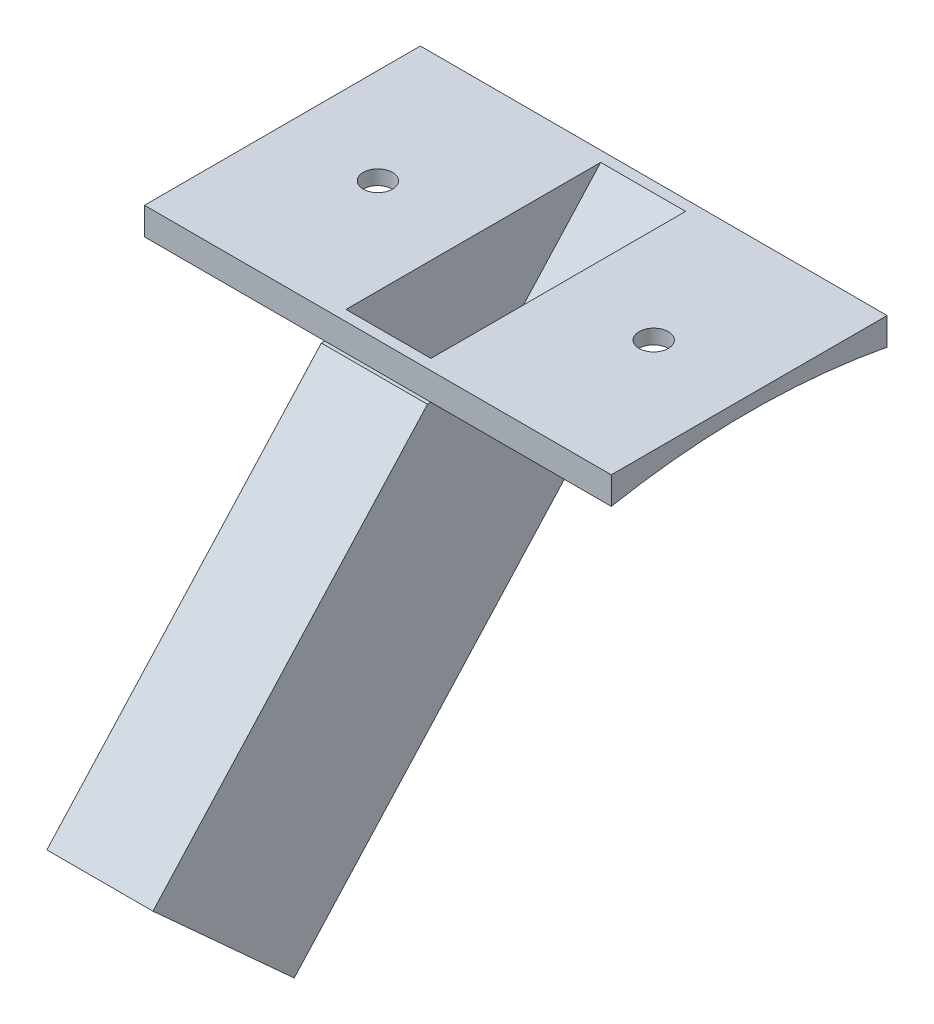
ISO-10303-21;
HEADER;
FILE_DESCRIPTION(('STEP AP214'),'2;1');
FILE_NAME('part.step','',(''),(''),'','','');
FILE_SCHEMA(('AUTOMOTIVE_DESIGN { 1 0 10303 214 1 1 1 1 }'));
ENDSEC;
DATA;
#1=APPLICATION_CONTEXT('core data for automotive mechanical design processes');
#2=APPLICATION_PROTOCOL_DEFINITION('international standard','automotive_design',2000,#1);
#3=PRODUCT_CONTEXT('',#1,'mechanical');
#4=PRODUCT('Part','Part','',(#3));
#5=PRODUCT_RELATED_PRODUCT_CATEGORY('part','',(#4));
#6=PRODUCT_DEFINITION_FORMATION('','',#4);
#7=PRODUCT_DEFINITION_CONTEXT('part definition',#1,'design');
#8=PRODUCT_DEFINITION('design','',#6,#7);
#9=PRODUCT_DEFINITION_SHAPE('','',#8);
#10=(LENGTH_UNIT() NAMED_UNIT(*) SI_UNIT(.MILLI.,.METRE.));
#11=(NAMED_UNIT(*) PLANE_ANGLE_UNIT() SI_UNIT($,.RADIAN.));
#12=(NAMED_UNIT(*) SI_UNIT($,.STERADIAN.) SOLID_ANGLE_UNIT());
#13=UNCERTAINTY_MEASURE_WITH_UNIT(LENGTH_MEASURE(1.E-05),#10,'distance_accuracy_value','');
#14=(GEOMETRIC_REPRESENTATION_CONTEXT(3) GLOBAL_UNCERTAINTY_ASSIGNED_CONTEXT((#13)) GLOBAL_UNIT_ASSIGNED_CONTEXT((#10,
#11,#12)) REPRESENTATION_CONTEXT('',''));
#15=CARTESIAN_POINT('',(0.,0.,0.));
#16=DIRECTION('',(0.,0.,1.));
#17=DIRECTION('',(1.,0.,0.));
#18=AXIS2_PLACEMENT_3D('',#15,#16,#17);
#19=CARTESIAN_POINT('',(0.,0.,0.));
#20=DIRECTION('',(0.,-1.,0.));
#21=DIRECTION('',(0.,0.,-1.));
#22=AXIS2_PLACEMENT_3D('',#19,#20,#21);
#23=PLANE('',#22);
#24=DIRECTION('',(-1.,0.,0.));
#25=VECTOR('',#24,1.);
#26=CARTESIAN_POINT('',(0.,0.,-26.));
#27=LINE('',#26,#25);
#28=CARTESIAN_POINT('',(27.,0.,-26.));
#29=VERTEX_POINT('',#28);
#30=CARTESIAN_POINT('',(17.,0.,-26.));
#31=VERTEX_POINT('',#30);
#32=EDGE_CURVE('E264',#29,#31,#27,.T.);
#33=ORIENTED_EDGE('',*,*,#32,.F.);
#34=DIRECTION('',(0.,0.,1.));
#35=VECTOR('',#34,1.);
#36=CARTESIAN_POINT('',(27.,0.,0.));
#37=LINE('',#36,#35);
#38=CARTESIAN_POINT('',(27.,0.,-24.0048577103315));
#39=VERTEX_POINT('',#38);
#40=EDGE_CURVE('E241',#29,#39,#37,.T.);
#41=ORIENTED_EDGE('',*,*,#40,.T.);
#42=DIRECTION('',(-1.,0.,0.));
#43=VECTOR('',#42,1.);
#44=CARTESIAN_POINT('',(0.,0.,-24.0048577103315));
#45=LINE('',#44,#43);
#46=CARTESIAN_POINT('',(26.,0.,-24.0048577103315));
#47=VERTEX_POINT('',#46);
#48=EDGE_CURVE('E371',#39,#47,#45,.T.);
#49=ORIENTED_EDGE('',*,*,#48,.T.);
#50=DIRECTION('',(0.,0.,-1.));
#51=VECTOR('',#50,1.);
#52=CARTESIAN_POINT('',(26.,0.,0.));
#53=LINE('',#52,#51);
#54=CARTESIAN_POINT('',(26.,0.,-25.));
#55=VERTEX_POINT('',#54);
#56=EDGE_CURVE('E361',#47,#55,#53,.T.);
#57=ORIENTED_EDGE('',*,*,#56,.T.);
#58=DIRECTION('',(-1.,0.,0.));
#59=VECTOR('',#58,1.);
#60=CARTESIAN_POINT('',(26.,0.,-25.));
#61=LINE('',#60,#59);
#62=CARTESIAN_POINT('',(18.,0.,-25.));
#63=VERTEX_POINT('',#62);
#64=EDGE_CURVE('E318',#55,#63,#61,.T.);
#65=ORIENTED_EDGE('',*,*,#64,.T.);
#66=DIRECTION('',(0.,0.,-1.));
#67=VECTOR('',#66,1.);
#68=CARTESIAN_POINT('',(18.,0.,0.));
#69=LINE('',#68,#67);
#70=CARTESIAN_POINT('',(18.,0.,-24.0048577103315));
#71=VERTEX_POINT('',#70);
#72=EDGE_CURVE('E270',#71,#63,#69,.T.);
#73=ORIENTED_EDGE('',*,*,#72,.F.);
#74=DIRECTION('',(1.,0.,0.));
#75=VECTOR('',#74,1.);
#76=CARTESIAN_POINT('',(17.,0.,-24.0048577103315));
#77=LINE('',#76,#75);
#78=CARTESIAN_POINT('',(17.,0.,-24.0048577103315));
#79=VERTEX_POINT('',#78);
#80=EDGE_CURVE('E432',#79,#71,#77,.T.);
#81=ORIENTED_EDGE('',*,*,#80,.F.);
#82=DIRECTION('',(0.,0.,-1.));
#83=VECTOR('',#82,1.);
#84=CARTESIAN_POINT('',(17.,0.,0.));
#85=LINE('',#84,#83);
#86=EDGE_CURVE('E266',#79,#31,#85,.T.);
#87=ORIENTED_EDGE('',*,*,#86,.T.);
#88=EDGE_LOOP('',(#33,#41,#49,#57,#65,#73,#81,#87));
#89=FACE_BOUND('',#88,.T.);
#90=ADVANCED_FACE('F83',(#89),#23,.T.);
#91=CARTESIAN_POINT('',(9.,2.58,-13.));
#92=DIRECTION('',(0.,-1.,0.));
#93=DIRECTION('',(0.,0.,-1.));
#94=AXIS2_PLACEMENT_3D('',#91,#92,#93);
#95=CYLINDRICAL_SURFACE('',#94,1.375);
#96=CARTESIAN_POINT('',(9.,2.58,-13.));
#97=DIRECTION('',(0.,1.,0.));
#98=DIRECTION('',(0.,0.,1.));
#99=AXIS2_PLACEMENT_3D('',#96,#97,#98);
#100=CIRCLE('',#99,1.375);
#101=CARTESIAN_POINT('',(9.,2.58,-11.625));
#102=VERTEX_POINT('',#101);
#103=EDGE_CURVE('E333',#102,#102,#100,.T.);
#104=ORIENTED_EDGE('',*,*,#103,.T.);
#105=EDGE_LOOP('',(#104));
#106=FACE_BOUND('',#105,.T.);
#107=CARTESIAN_POINT('',(9.,1.20422907674551,-14.375));
#108=CARTESIAN_POINT('',(9.07722635972252,1.20422925922536,-14.3749965778021));
#109=CARTESIAN_POINT('',(9.15450852622286,1.20435827229139,-14.3684720815965));
#110=CARTESIAN_POINT('',(9.30694391972172,1.20486052009371,-14.3425354182376));
#111=CARTESIAN_POINT('',(9.38209447963539,1.2052340478231,-14.3231077893172));
#112=CARTESIAN_POINT('',(9.52803622976737,1.20618299495688,-14.2719186259231));
#113=CARTESIAN_POINT('',(9.59882950474839,1.20675831691523,-14.2401630438034));
#114=CARTESIAN_POINT('',(9.73406029699775,1.20804590010858,-14.165227730328));
#115=CARTESIAN_POINT('',(9.79849937690933,1.20875812754765,-14.1220508174079));
#116=CARTESIAN_POINT('',(9.91923050893597,1.21023950541458,-14.0254835919622));
#117=CARTESIAN_POINT('',(9.975520723317,1.21100866862368,-13.9720909818738));
#118=CARTESIAN_POINT('',(10.0783410454062,1.21251711035448,-13.8566112451152));
#119=CARTESIAN_POINT('',(10.1248707675212,1.21325638769458,-13.7945237751118));
#120=CARTESIAN_POINT('',(10.2068494251572,1.21462173382232,-13.6634134468131));
#121=CARTESIAN_POINT('',(10.2422976715794,1.21524779556865,-13.5943901575682));
#122=CARTESIAN_POINT('',(10.3011024734433,1.21631606744527,-13.4513706670465));
#123=CARTESIAN_POINT('',(10.3244590635521,1.21675827810266,-13.3773744800277));
#124=CARTESIAN_POINT('',(10.3584147286866,1.21740894578999,-13.2265197284383));
#125=CARTESIAN_POINT('',(10.3690154479099,1.21761743294603,-13.1496615340896));
#126=CARTESIAN_POINT('',(10.3771635055245,1.2177772507653,-12.9952562209101));
#127=CARTESIAN_POINT('',(10.3747108796823,1.21772858213314,-12.9177091039675));
#128=CARTESIAN_POINT('',(10.3568233015879,1.21737960162679,-12.7641383906789));
#129=CARTESIAN_POINT('',(10.3413901369911,1.21707932440367,-12.6881145860211));
#130=CARTESIAN_POINT('',(10.2979823301367,1.21626101519384,-12.5397371252623));
#131=CARTESIAN_POINT('',(10.2700076684819,1.21574298287034,-12.4673834748379));
#132=CARTESIAN_POINT('',(10.202308923897,1.21454749966555,-12.3283945078092));
#133=CARTESIAN_POINT('',(10.1625840211024,1.21387003766086,-12.2617595906441));
#134=CARTESIAN_POINT('',(10.0725130767538,1.21243206089527,-12.1361040346502));
#135=CARTESIAN_POINT('',(10.0221670272466,1.21167154607219,-12.077083401523));
#136=CARTESIAN_POINT('',(9.91227280209361,1.2101530391684,-11.9683213598585));
#137=CARTESIAN_POINT('',(9.85272307236859,1.20939504753586,-11.9185815215581));
#138=CARTESIAN_POINT('',(9.72611739412462,1.20796717369575,-11.8298051054661));
#139=CARTESIAN_POINT('',(9.65906144453048,1.20729729150081,-11.7907685292078));
#140=CARTESIAN_POINT('',(9.51934597188904,1.20612117415348,-11.7245069466392));
#141=CARTESIAN_POINT('',(9.44668642607278,1.20561493966609,-11.6972819883257));
#142=CARTESIAN_POINT('',(9.29782672344957,1.20482322412525,-11.6554174676884));
#143=CARTESIAN_POINT('',(9.22162657086783,1.20453774280838,-11.6407778903462));
#144=CARTESIAN_POINT('',(9.06786237981598,1.20421976759143,-11.6245016216336));
#145=CARTESIAN_POINT('',(8.99029857146114,1.20418723141015,-11.6228627571205));
#146=CARTESIAN_POINT('',(8.83599687015679,1.20437870455899,-11.6326287757042));
#147=CARTESIAN_POINT('',(8.75925897681856,1.20460271376836,-11.6440336526617));
#148=CARTESIAN_POINT('',(8.60879349868505,1.20528198509952,-11.679561608455));
#149=CARTESIAN_POINT('',(8.53506568122556,1.20573722931127,-11.7036837022988));
#150=CARTESIAN_POINT('',(8.39270611899893,1.20682763243699,-11.763960341757));
#151=CARTESIAN_POINT('',(8.32407437825562,1.20746279149301,-11.800114896872));
#152=CARTESIAN_POINT('',(8.19384518827104,1.20884152171538,-11.8834357536232));
#153=CARTESIAN_POINT('',(8.13224867589081,1.20958510729063,-11.9306035193167));
#154=CARTESIAN_POINT('',(8.01784786014967,1.21109680968514,-12.0346097169091));
#155=CARTESIAN_POINT('',(7.96504356843358,1.21186492653688,-12.0914481616161));
#156=CARTESIAN_POINT('',(7.86971890947505,1.2133392189782,-12.2131915601435));
#157=CARTESIAN_POINT('',(7.82719994464436,1.21404538611253,-12.2780976121635));
#158=CARTESIAN_POINT('',(7.7536625243673,1.21531604847893,-12.4141280930273));
#159=CARTESIAN_POINT('',(7.72264405086348,1.21588054393345,-12.4852525121073));
#160=CARTESIAN_POINT('',(7.67299055581979,1.21680418444882,-12.6316954519812));
#161=CARTESIAN_POINT('',(7.65435462073044,1.21716334465848,-12.7070136629244));
#162=CARTESIAN_POINT('',(7.62999220493068,1.21763588503614,-12.859710631891));
#163=CARTESIAN_POINT('',(7.62426573266799,1.21774926504331,-12.9370893912628));
#164=CARTESIAN_POINT('',(7.62588493356544,1.21771746338109,-13.0916967469374));
#165=CARTESIAN_POINT('',(7.63322838421403,1.21757232567205,-13.1689253665357));
#166=CARTESIAN_POINT('',(7.66077443330527,1.21703993367491,-13.3210534579114));
#167=CARTESIAN_POINT('',(7.68097705745832,1.21665267890273,-13.3959529250316));
#168=CARTESIAN_POINT('',(7.73366793805393,1.21567968987264,-13.5412981089894));
#169=CARTESIAN_POINT('',(7.76615641679409,1.21509395202345,-13.6117437452135));
#170=CARTESIAN_POINT('',(7.8424952144603,1.21379003459265,-13.746178557171));
#171=CARTESIAN_POINT('',(7.88634510238561,1.2130718600354,-13.8101679776963));
#172=CARTESIAN_POINT('',(7.98416548283499,1.21158392863804,-13.929882260776));
#173=CARTESIAN_POINT('',(8.03813661932898,1.21081416851779,-13.9856065970557));
#174=CARTESIAN_POINT('',(8.15468381736885,1.20930967106807,-14.0872180520323));
#175=CARTESIAN_POINT('',(8.21726201086848,1.20857494247677,-14.1331027262324));
#176=CARTESIAN_POINT('',(8.34926364975008,1.20722318007119,-14.2137358543079));
#177=CARTESIAN_POINT('',(8.41869084406728,1.20660621126335,-14.2484781644681));
#178=CARTESIAN_POINT('',(8.56233975140486,1.20556081816515,-14.3057734630573));
#179=CARTESIAN_POINT('',(8.63655561000771,1.20513216847134,-14.3283410311322));
#180=CARTESIAN_POINT('',(8.75936889400867,1.20462667952689,-14.3546461035783));
#181=CARTESIAN_POINT('',(8.80716866640241,1.20447822313693,-14.3622692554746));
#182=CARTESIAN_POINT('',(8.90330499835014,1.20427936461875,-14.3724472748441));
#183=CARTESIAN_POINT('',(8.95164155783722,1.2042289624783,-14.3750021429491));
#184=CARTESIAN_POINT('',(9.,1.20422907674551,-14.375));
#185=B_SPLINE_CURVE_WITH_KNOTS('',3,(#107,#108,#109,#110,#111,#112,#113,#114,#115,#116,#117,
#118,#119,#120,#121,#122,#123,#124,#125,#126,#127,#128,#129,#130,#131,#132,#133,#134,#135,#136,
#137,#138,#139,#140,#141,#142,#143,#144,#145,#146,#147,#148,#149,#150,#151,#152,#153,#154,#155,
#156,#157,#158,#159,#160,#161,#162,#163,#164,#165,#166,#167,#168,#169,#170,#171,#172,#173,#174,
#175,#176,#177,#178,#179,#180,#181,#182,#183,#184),.UNSPECIFIED.,.T.,.F.,(4,2,2,2,2,2,2,2,2,2,2,
2,2,2,2,2,2,2,2,2,2,2,2,2,2,2,2,2,2,2,2,2,2,2,2,2,2,2,4),(0.,0.231502568231079,
0.463283046683954,0.694951752566139,0.926563342930743,1.15822708529487,1.38989997792977,
1.62158727421938,1.85327390625242,2.08493067130045,2.31658680160356,2.54821103388498,
2.7798356244099,3.01147638018658,3.2431173094169,3.47479739498674,3.70647751374237,
3.9381585739281,4.16983935764248,4.40148141378296,4.63312336089526,4.86474736918341,
5.09637156035799,5.32802656038249,5.55968186721931,5.79136874264327,6.02305525428396,
6.25472467083556,6.48639423898734,6.71802441600369,6.94965505613843,7.18128988754838,
7.41291593306137,7.6445567209102,7.87625498947641,8.10808079386571,8.33962835963073,
8.48459317465356,8.62955797160325),.UNSPECIFIED.);
#186=CARTESIAN_POINT('',(9.,1.20422907674551,-14.375));
#187=VERTEX_POINT('',#186);
#188=EDGE_CURVE('E462',#187,#187,#185,.T.);
#189=ORIENTED_EDGE('',*,*,#188,.T.);
#190=EDGE_LOOP('',(#189));
#191=FACE_BOUND('',#190,.T.);
#192=ADVANCED_FACE('F473',(#106,#191),#95,.F.);
#193=CARTESIAN_POINT('',(18.,2.58,0.));
#194=DIRECTION('',(-1.,0.,0.));
#195=DIRECTION('',(0.,0.,1.));
#196=AXIS2_PLACEMENT_3D('',#193,#194,#195);
#197=PLANE('',#196);
#198=DIRECTION('',(0.,0.,1.));
#199=VECTOR('',#198,1.);
#200=CARTESIAN_POINT('',(18.,0.,-1.02313640039524));
#201=LINE('',#200,#199);
#202=CARTESIAN_POINT('',(18.,0.,-1.02313640039524));
#203=VERTEX_POINT('',#202);
#204=CARTESIAN_POINT('',(18.,0.,-1.));
#205=VERTEX_POINT('',#204);
#206=EDGE_CURVE('E455',#203,#205,#201,.T.);
#207=ORIENTED_EDGE('',*,*,#206,.F.);
#208=DIRECTION('',(0.,0.739718307899314,-0.672916655283977));
#209=VECTOR('',#208,1.);
#210=CARTESIAN_POINT('',(18.,-0.509285347161767,-0.55984302406876));
#211=LINE('',#210,#209);
#212=CARTESIAN_POINT('',(18.,-28.371942438135,24.7866244308562));
#213=VERTEX_POINT('',#212);
#214=EDGE_CURVE('E98',#213,#203,#211,.T.);
#215=ORIENTED_EDGE('',*,*,#214,.F.);
#216=DIRECTION('',(0.,0.672916655283977,0.739718307899314));
#217=VECTOR('',#216,1.);
#218=CARTESIAN_POINT('',(18.,-30.054234076345,22.9373286611079));
#219=LINE('',#218,#217);
#220=CARTESIAN_POINT('',(18.,-30.054234076345,22.9373286611079));
#221=VERTEX_POINT('',#220);
#222=EDGE_CURVE('E407',#221,#213,#219,.T.);
#223=ORIENTED_EDGE('',*,*,#222,.F.);
#224=DIRECTION('',(0.,0.739718307899315,-0.672916655283976));
#225=VECTOR('',#224,1.);
#226=CARTESIAN_POINT('',(18.,-30.7939523842443,23.6102453163919));
#227=LINE('',#226,#225);
#228=CARTESIAN_POINT('',(18.,-30.7939523842443,23.6102453163919));
#229=VERTEX_POINT('',#228);
#230=EDGE_CURVE('E417',#229,#221,#227,.T.);
#231=ORIENTED_EDGE('',*,*,#230,.F.);
#232=DIRECTION('',(0.,0.672916655283974,0.739718307899317));
#233=VECTOR('',#232,1.);
#234=CARTESIAN_POINT('',(18.,-40.5512438858619,12.8843298518518));
#235=LINE('',#234,#233);
#236=CARTESIAN_POINT('',(18.,-38.196035592368,15.4733439294994));
#237=VERTEX_POINT('',#236);
#238=EDGE_CURVE('E438',#237,#229,#235,.T.);
#239=ORIENTED_EDGE('',*,*,#238,.F.);
#240=DIRECTION('',(0.,-0.739718307899321,0.672916655283969));
#241=VECTOR('',#240,1.);
#242=CARTESIAN_POINT('',(18.,-38.196035592368,15.4733439294994));
#243=LINE('',#242,#241);
#244=CARTESIAN_POINT('',(18.,-37.4563172844687,14.8004272742154));
#245=VERTEX_POINT('',#244);
#246=EDGE_CURVE('E393',#245,#237,#243,.T.);
#247=ORIENTED_EDGE('',*,*,#246,.F.);
#248=DIRECTION('',(0.,-0.672916655283972,-0.739718307899319));
#249=VECTOR('',#248,1.);
#250=CARTESIAN_POINT('',(18.,-37.4563172844687,14.8004272742154));
#251=LINE('',#250,#249);
#252=CARTESIAN_POINT('',(18.,-39.1386089226786,12.9511315044671));
#253=VERTEX_POINT('',#252);
#254=EDGE_CURVE('E388',#245,#253,#251,.T.);
#255=ORIENTED_EDGE('',*,*,#254,.T.);
#256=DIRECTION('',(0.,-0.739718307899319,0.672916655283972));
#257=VECTOR('',#256,1.);
#258=CARTESIAN_POINT('',(18.,-11.2759518317051,-12.3953359504577));
#259=LINE('',#258,#257);
#260=CARTESIAN_POINT('',(18.,2.58,-25.));
#261=VERTEX_POINT('',#260);
#262=EDGE_CURVE('E383',#261,#253,#259,.T.);
#263=ORIENTED_EDGE('',*,*,#262,.F.);
#264=DIRECTION('',(0.,0.,-1.));
#265=VECTOR('',#264,1.);
#266=CARTESIAN_POINT('',(18.,2.58,0.));
#267=LINE('',#266,#265);
#268=CARTESIAN_POINT('',(18.,2.58,-0.999999999999998));
#269=VERTEX_POINT('',#268);
#270=EDGE_CURVE('E316',#269,#261,#267,.T.);
#271=ORIENTED_EDGE('',*,*,#270,.F.);
#272=DIRECTION('',(0.,1.,0.));
#273=VECTOR('',#272,1.);
#274=CARTESIAN_POINT('',(18.,2.58,-0.999999999999998));
#275=LINE('',#274,#273);
#276=EDGE_CURVE('E317',#205,#269,#275,.T.);
#277=ORIENTED_EDGE('',*,*,#276,.F.);
#278=EDGE_LOOP('',(#207,#215,#223,#231,#239,#247,#255,#263,#271,#277));
#279=FACE_BOUND('',#278,.T.);
#280=ADVANCED_FACE('F525',(#279),#197,.F.);
#281=CARTESIAN_POINT('',(27.,-11.2759518317051,-12.3953359504577));
#282=DIRECTION('',(0.,-0.672916655283972,-0.739718307899319));
#283=DIRECTION('',(0.,0.739718307899319,-0.672916655283972));
#284=AXIS2_PLACEMENT_3D('',#281,#282,#283);
#285=PLANE('',#284);
#286=DIRECTION('',(-1.,0.,0.));
#287=VECTOR('',#286,1.);
#288=CARTESIAN_POINT('',(18.,-39.1386089226786,12.9511315044671));
#289=LINE('',#288,#287);
#290=CARTESIAN_POINT('',(26.,-39.1386089226786,12.9511315044671));
#291=VERTEX_POINT('',#290);
#292=EDGE_CURVE('E297',#291,#253,#289,.T.);
#293=ORIENTED_EDGE('',*,*,#292,.F.);
#294=DIRECTION('',(0.,0.739718307899319,-0.672916655283972));
#295=VECTOR('',#294,1.);
#296=CARTESIAN_POINT('',(26.,-11.2759518317051,-12.3953359504577));
#297=LINE('',#296,#295);
#298=CARTESIAN_POINT('',(26.,2.58,-25.));
#299=VERTEX_POINT('',#298);
#300=EDGE_CURVE('E91',#291,#299,#297,.T.);
#301=ORIENTED_EDGE('',*,*,#300,.T.);
#302=DIRECTION('',(-1.,0.,0.));
#303=VECTOR('',#302,1.);
#304=CARTESIAN_POINT('',(26.,2.58,-25.));
#305=LINE('',#304,#303);
#306=EDGE_CURVE('E295',#299,#261,#305,.T.);
#307=ORIENTED_EDGE('',*,*,#306,.T.);
#308=ORIENTED_EDGE('',*,*,#262,.T.);
#309=EDGE_LOOP('',(#293,#301,#307,#308));
#310=FACE_BOUND('',#309,.T.);
#311=ADVANCED_FACE('F293',(#310),#285,.F.);
#312=DIRECTION('',(0.,0.739718307899319,-0.672916655283972));
#313=VECTOR('',#312,1.);
#314=CARTESIAN_POINT('',(18.,-11.9488684869891,-13.135054258357));
#315=LINE('',#314,#313);
#316=CARTESIAN_POINT('',(18.,1.09393186340737,-25.));
#317=VERTEX_POINT('',#316);
#318=EDGE_CURVE('E385',#71,#317,#315,.T.);
#319=ORIENTED_EDGE('',*,*,#318,.F.);
#320=ORIENTED_EDGE('',*,*,#72,.T.);
#321=DIRECTION('',(0.,-1.,0.));
#322=VECTOR('',#321,1.);
#323=CARTESIAN_POINT('',(18.,2.58,-25.));
#324=LINE('',#323,#322);
#325=EDGE_CURVE('E359',#317,#63,#324,.T.);
#326=ORIENTED_EDGE('',*,*,#325,.F.);
#327=EDGE_LOOP('',(#319,#320,#326));
#328=FACE_BOUND('',#327,.T.);
#329=ADVANCED_FACE('F524',(#328),#197,.F.);
#330=CARTESIAN_POINT('',(26.,2.58,-25.));
#331=DIRECTION('',(0.,0.,-1.));
#332=DIRECTION('',(-1.,0.,0.));
#333=AXIS2_PLACEMENT_3D('',#330,#331,#332);
#334=PLANE('',#333);
#335=DIRECTION('',(-1.,0.,0.));
#336=VECTOR('',#335,1.);
#337=CARTESIAN_POINT('',(27.,1.09393186340737,-25.));
#338=LINE('',#337,#336);
#339=CARTESIAN_POINT('',(26.,1.09393186340737,-25.));
#340=VERTEX_POINT('',#339);
#341=EDGE_CURVE('E106',#340,#317,#338,.T.);
#342=ORIENTED_EDGE('',*,*,#341,.T.);
#343=ORIENTED_EDGE('',*,*,#325,.T.);
#344=ORIENTED_EDGE('',*,*,#64,.F.);
#345=DIRECTION('',(0.,-1.,0.));
#346=VECTOR('',#345,1.);
#347=CARTESIAN_POINT('',(26.,2.58,-25.));
#348=LINE('',#347,#346);
#349=EDGE_CURVE('E323',#340,#55,#348,.T.);
#350=ORIENTED_EDGE('',*,*,#349,.F.);
#351=EDGE_LOOP('',(#342,#343,#344,#350));
#352=FACE_BOUND('',#351,.T.);
#353=ADVANCED_FACE('F364',(#352),#334,.F.);
#354=CARTESIAN_POINT('',(26.,0.,0.));
#355=DIRECTION('',(1.,0.,0.));
#356=DIRECTION('',(0.,0.,-1.));
#357=AXIS2_PLACEMENT_3D('',#354,#355,#356);
#358=PLANE('',#357);
#359=DIRECTION('',(0.,-0.739718307899319,0.672916655283972));
#360=VECTOR('',#359,1.);
#361=CARTESIAN_POINT('',(26.,-11.9488684869891,-13.135054258357));
#362=LINE('',#361,#360);
#363=EDGE_CURVE('E12',#340,#47,#362,.T.);
#364=ORIENTED_EDGE('',*,*,#363,.F.);
#365=ORIENTED_EDGE('',*,*,#349,.T.);
#366=ORIENTED_EDGE('',*,*,#56,.F.);
#367=EDGE_LOOP('',(#364,#365,#366));
#368=FACE_BOUND('',#367,.T.);
#369=ADVANCED_FACE('F557',(#368),#358,.F.);
#370=ORIENTED_EDGE('',*,*,#300,.F.);
#371=DIRECTION('',(0.,-0.672916655283972,-0.739718307899319));
#372=VECTOR('',#371,1.);
#373=CARTESIAN_POINT('',(26.,-37.4563172844687,14.8004272742154));
#374=LINE('',#373,#372);
#375=CARTESIAN_POINT('',(26.,-37.4563172844687,14.8004272742154));
#376=VERTEX_POINT('',#375);
#377=EDGE_CURVE('E301',#376,#291,#374,.T.);
#378=ORIENTED_EDGE('',*,*,#377,.F.);
#379=DIRECTION('',(0.,0.739718307899321,-0.672916655283969));
#380=VECTOR('',#379,1.);
#381=CARTESIAN_POINT('',(26.,-38.196035592368,15.4733439294994));
#382=LINE('',#381,#380);
#383=CARTESIAN_POINT('',(26.,-38.196035592368,15.4733439294994));
#384=VERTEX_POINT('',#383);
#385=EDGE_CURVE('E397',#384,#376,#382,.T.);
#386=ORIENTED_EDGE('',*,*,#385,.F.);
#387=DIRECTION('',(0.,0.672916655283975,0.739718307899317));
#388=VECTOR('',#387,1.);
#389=CARTESIAN_POINT('',(26.,-28.6023753988727,26.0193841102088));
#390=LINE('',#389,#388);
#391=CARTESIAN_POINT('',(26.,-30.7939523842443,23.6102453163919));
#392=VERTEX_POINT('',#391);
#393=EDGE_CURVE('E405',#384,#392,#390,.T.);
#394=ORIENTED_EDGE('',*,*,#393,.T.);
#395=DIRECTION('',(0.,-0.739718307899315,0.672916655283976));
#396=VECTOR('',#395,1.);
#397=CARTESIAN_POINT('',(26.,-30.7939523842443,23.6102453163919));
#398=LINE('',#397,#396);
#399=CARTESIAN_POINT('',(26.,-30.054234076345,22.9373286611079));
#400=VERTEX_POINT('',#399);
#401=EDGE_CURVE('E421',#400,#392,#398,.T.);
#402=ORIENTED_EDGE('',*,*,#401,.F.);
#403=DIRECTION('',(0.,0.672916655283977,0.739718307899314));
#404=VECTOR('',#403,1.);
#405=CARTESIAN_POINT('',(26.,-30.054234076345,22.9373286611079));
#406=LINE('',#405,#404);
#407=CARTESIAN_POINT('',(26.,-28.371942438135,24.7866244308562));
#408=VERTEX_POINT('',#407);
#409=EDGE_CURVE('E410',#400,#408,#406,.T.);
#410=ORIENTED_EDGE('',*,*,#409,.T.);
#411=DIRECTION('',(0.,0.739718307899314,-0.672916655283977));
#412=VECTOR('',#411,1.);
#413=CARTESIAN_POINT('',(26.,-0.509285347161767,-0.55984302406876));
#414=LINE('',#413,#412);
#415=CARTESIAN_POINT('',(26.,0.,-1.02313640039531));
#416=VERTEX_POINT('',#415);
#417=EDGE_CURVE('E394',#408,#416,#414,.T.);
#418=ORIENTED_EDGE('',*,*,#417,.T.);
#419=CARTESIAN_POINT('',(26.,0.,-1.00000000000001));
#420=VERTEX_POINT('',#419);
#421=EDGE_CURVE('E311',#420,#416,#53,.T.);
#422=ORIENTED_EDGE('',*,*,#421,.F.);
#423=DIRECTION('',(0.,1.,0.));
#424=VECTOR('',#423,1.);
#425=CARTESIAN_POINT('',(26.,2.58,-0.999999999999998));
#426=LINE('',#425,#424);
#427=CARTESIAN_POINT('',(26.,2.58,-0.999999999999998));
#428=VERTEX_POINT('',#427);
#429=EDGE_CURVE('E307',#420,#428,#426,.T.);
#430=ORIENTED_EDGE('',*,*,#429,.T.);
#431=DIRECTION('',(0.,0.,1.));
#432=VECTOR('',#431,1.);
#433=CARTESIAN_POINT('',(26.,2.58,0.));
#434=LINE('',#433,#432);
#435=EDGE_CURVE('E305',#299,#428,#434,.T.);
#436=ORIENTED_EDGE('',*,*,#435,.F.);
#437=EDGE_LOOP('',(#370,#378,#386,#394,#402,#410,#418,#422,#430,#436));
#438=FACE_BOUND('',#437,.T.);
#439=ADVANCED_FACE('F300',(#438),#358,.F.);
#440=CARTESIAN_POINT('',(0.,2.58,0.));
#441=DIRECTION('',(0.,-1.,0.));
#442=DIRECTION('',(0.,0.,-1.));
#443=AXIS2_PLACEMENT_3D('',#440,#441,#442);
#444=PLANE('',#443);
#445=CARTESIAN_POINT('',(35.,2.58,-13.));
#446=DIRECTION('',(0.,1.,0.));
#447=DIRECTION('',(0.,0.,1.));
#448=AXIS2_PLACEMENT_3D('',#445,#446,#447);
#449=CIRCLE('',#448,1.375);
#450=CARTESIAN_POINT('',(35.,2.58,-11.625));
#451=VERTEX_POINT('',#450);
#452=EDGE_CURVE('E355',#451,#451,#449,.T.);
#453=ORIENTED_EDGE('',*,*,#452,.F.);
#454=EDGE_LOOP('',(#453));
#455=FACE_BOUND('',#454,.T.);
#456=DIRECTION('',(1.,0.,0.));
#457=VECTOR('',#456,1.);
#458=CARTESIAN_POINT('',(0.,2.58,0.));
#459=LINE('',#458,#457);
#460=CARTESIAN_POINT('',(0.,2.58,0.));
#461=VERTEX_POINT('',#460);
#462=CARTESIAN_POINT('',(44.,2.58,0.));
#463=VERTEX_POINT('',#462);
#464=EDGE_CURVE('E278',#461,#463,#459,.T.);
#465=ORIENTED_EDGE('',*,*,#464,.T.);
#466=DIRECTION('',(0.,0.,1.));
#467=VECTOR('',#466,1.);
#468=CARTESIAN_POINT('',(44.,2.58,0.));
#469=LINE('',#468,#467);
#470=CARTESIAN_POINT('',(44.,2.58,-26.));
#471=VERTEX_POINT('',#470);
#472=EDGE_CURVE('E351',#471,#463,#469,.T.);
#473=ORIENTED_EDGE('',*,*,#472,.F.);
#474=DIRECTION('',(-1.,0.,0.));
#475=VECTOR('',#474,1.);
#476=CARTESIAN_POINT('',(0.,2.58,-26.));
#477=LINE('',#476,#475);
#478=CARTESIAN_POINT('',(0.,2.58,-26.));
#479=VERTEX_POINT('',#478);
#480=EDGE_CURVE('E287',#471,#479,#477,.T.);
#481=ORIENTED_EDGE('',*,*,#480,.T.);
#482=DIRECTION('',(0.,0.,1.));
#483=VECTOR('',#482,1.);
#484=CARTESIAN_POINT('',(0.,2.58,0.));
#485=LINE('',#484,#483);
#486=EDGE_CURVE('E276',#479,#461,#485,.T.);
#487=ORIENTED_EDGE('',*,*,#486,.T.);
#488=EDGE_LOOP('',(#465,#473,#481,#487));
#489=FACE_BOUND('',#488,.T.);
#490=ORIENTED_EDGE('',*,*,#435,.T.);
#491=DIRECTION('',(-1.,0.,0.));
#492=VECTOR('',#491,1.);
#493=CARTESIAN_POINT('',(26.,2.58,-0.999999999999998));
#494=LINE('',#493,#492);
#495=EDGE_CURVE('E327',#428,#269,#494,.T.);
#496=ORIENTED_EDGE('',*,*,#495,.T.);
#497=ORIENTED_EDGE('',*,*,#270,.T.);
#498=ORIENTED_EDGE('',*,*,#306,.F.);
#499=EDGE_LOOP('',(#490,#496,#497,#498));
#500=FACE_BOUND('',#499,.T.);
#501=ORIENTED_EDGE('',*,*,#103,.F.);
#502=EDGE_LOOP('',(#501));
#503=FACE_BOUND('',#502,.T.);
#504=ADVANCED_FACE('F314',(#455,#489,#500,#503),#444,.F.);
#505=CARTESIAN_POINT('',(0.,2.58,0.));
#506=DIRECTION('',(1.,0.,0.));
#507=DIRECTION('',(0.,0.,-1.));
#508=AXIS2_PLACEMENT_3D('',#505,#506,#507);
#509=PLANE('',#508);
#510=CARTESIAN_POINT('',(0.,-68.7822651560706,-13.));
#511=DIRECTION('',(-1.,0.,0.));
#512=DIRECTION('',(0.,0.,1.));
#513=AXIS2_PLACEMENT_3D('',#510,#511,#512);
#514=CIRCLE('',#513,70.);
#515=CARTESIAN_POINT('',(0.,0.,0.));
#516=VERTEX_POINT('',#515);
#517=CARTESIAN_POINT('',(0.,0.,-26.));
#518=VERTEX_POINT('',#517);
#519=EDGE_CURVE('E470',#516,#518,#514,.T.);
#520=ORIENTED_EDGE('',*,*,#519,.F.);
#521=DIRECTION('',(0.,-1.,0.));
#522=VECTOR('',#521,1.);
#523=CARTESIAN_POINT('',(0.,2.58,0.));
#524=LINE('',#523,#522);
#525=EDGE_CURVE('E286',#461,#516,#524,.T.);
#526=ORIENTED_EDGE('',*,*,#525,.F.);
#527=ORIENTED_EDGE('',*,*,#486,.F.);
#528=DIRECTION('',(0.,-1.,0.));
#529=VECTOR('',#528,1.);
#530=CARTESIAN_POINT('',(0.,2.58,-26.));
#531=LINE('',#530,#529);
#532=EDGE_CURVE('E283',#479,#518,#531,.T.);
#533=ORIENTED_EDGE('',*,*,#532,.T.);
#534=EDGE_LOOP('',(#520,#526,#527,#533));
#535=FACE_BOUND('',#534,.T.);
#536=ADVANCED_FACE('F85',(#535),#509,.F.);
#537=CARTESIAN_POINT('',(0.,2.58,0.));
#538=DIRECTION('',(0.,0.,-1.));
#539=DIRECTION('',(-1.,0.,0.));
#540=AXIS2_PLACEMENT_3D('',#537,#538,#539);
#541=PLANE('',#540);
#542=DIRECTION('',(1.,0.,0.));
#543=VECTOR('',#542,1.);
#544=CARTESIAN_POINT('',(0.,0.,0.));
#545=LINE('',#544,#543);
#546=CARTESIAN_POINT('',(17.,0.,0.));
#547=VERTEX_POINT('',#546);
#548=EDGE_CURVE('E338',#516,#547,#545,.T.);
#549=ORIENTED_EDGE('',*,*,#548,.T.);
#550=CARTESIAN_POINT('',(27.,0.,0.));
#551=VERTEX_POINT('',#550);
#552=EDGE_CURVE('E340',#547,#551,#545,.T.);
#553=ORIENTED_EDGE('',*,*,#552,.T.);
#554=CARTESIAN_POINT('',(44.,0.,0.));
#555=VERTEX_POINT('',#554);
#556=EDGE_CURVE('E260',#551,#555,#545,.T.);
#557=ORIENTED_EDGE('',*,*,#556,.T.);
#558=DIRECTION('',(0.,-1.,0.));
#559=VECTOR('',#558,1.);
#560=CARTESIAN_POINT('',(44.,2.58,0.));
#561=LINE('',#560,#559);
#562=EDGE_CURVE('E310',#463,#555,#561,.T.);
#563=ORIENTED_EDGE('',*,*,#562,.F.);
#564=ORIENTED_EDGE('',*,*,#464,.F.);
#565=ORIENTED_EDGE('',*,*,#525,.T.);
#566=EDGE_LOOP('',(#549,#553,#557,#563,#564,#565));
#567=FACE_BOUND('',#566,.T.);
#568=ADVANCED_FACE('F345',(#567),#541,.F.);
#569=CARTESIAN_POINT('',(0.,2.58,-26.));
#570=DIRECTION('',(0.,0.,1.));
#571=DIRECTION('',(1.,0.,0.));
#572=AXIS2_PLACEMENT_3D('',#569,#570,#571);
#573=PLANE('',#572);
#574=CARTESIAN_POINT('',(44.,0.,-26.));
#575=VERTEX_POINT('',#574);
#576=EDGE_CURVE('E257',#575,#29,#27,.T.);
#577=ORIENTED_EDGE('',*,*,#576,.T.);
#578=ORIENTED_EDGE('',*,*,#32,.T.);
#579=DIRECTION('',(1.,0.,0.));
#580=VECTOR('',#579,1.);
#581=CARTESIAN_POINT('',(0.,0.,-26.));
#582=LINE('',#581,#580);
#583=EDGE_CURVE('E460',#518,#31,#582,.T.);
#584=ORIENTED_EDGE('',*,*,#583,.F.);
#585=ORIENTED_EDGE('',*,*,#532,.F.);
#586=ORIENTED_EDGE('',*,*,#480,.F.);
#587=DIRECTION('',(0.,1.,0.));
#588=VECTOR('',#587,1.);
#589=CARTESIAN_POINT('',(44.,2.58,-26.));
#590=LINE('',#589,#588);
#591=EDGE_CURVE('E275',#575,#471,#590,.T.);
#592=ORIENTED_EDGE('',*,*,#591,.F.);
#593=EDGE_LOOP('',(#577,#578,#584,#585,#586,#592));
#594=FACE_BOUND('',#593,.T.);
#595=ADVANCED_FACE('F273',(#594),#573,.F.);
#596=CARTESIAN_POINT('',(26.,2.58,-0.999999999999998));
#597=DIRECTION('',(0.,0.,1.));
#598=DIRECTION('',(0.,-1.,0.));
#599=AXIS2_PLACEMENT_3D('',#596,#597,#598);
#600=PLANE('',#599);
#601=ORIENTED_EDGE('',*,*,#276,.T.);
#602=ORIENTED_EDGE('',*,*,#495,.F.);
#603=ORIENTED_EDGE('',*,*,#429,.F.);
#604=DIRECTION('',(-1.,0.,0.));
#605=VECTOR('',#604,1.);
#606=CARTESIAN_POINT('',(26.,0.,-1.00000000000001));
#607=LINE('',#606,#605);
#608=EDGE_CURVE('E330',#420,#205,#607,.T.);
#609=ORIENTED_EDGE('',*,*,#608,.T.);
#610=EDGE_LOOP('',(#601,#602,#603,#609));
#611=FACE_BOUND('',#610,.T.);
#612=ADVANCED_FACE('F573',(#611),#600,.F.);
#613=CARTESIAN_POINT('',(44.,0.,0.));
#614=DIRECTION('',(1.,0.,0.));
#615=DIRECTION('',(0.,0.,-1.));
#616=AXIS2_PLACEMENT_3D('',#613,#614,#615);
#617=PLANE('',#616);
#618=CARTESIAN_POINT('',(44.,-68.7822651560706,-13.));
#619=DIRECTION('',(1.,0.,0.));
#620=DIRECTION('',(0.,0.,-1.));
#621=AXIS2_PLACEMENT_3D('',#618,#619,#620);
#622=CIRCLE('',#621,70.);
#623=EDGE_CURVE('E261',#575,#555,#622,.T.);
#624=ORIENTED_EDGE('',*,*,#623,.F.);
#625=ORIENTED_EDGE('',*,*,#591,.T.);
#626=ORIENTED_EDGE('',*,*,#472,.T.);
#627=ORIENTED_EDGE('',*,*,#562,.T.);
#628=EDGE_LOOP('',(#624,#625,#626,#627));
#629=FACE_BOUND('',#628,.T.);
#630=ADVANCED_FACE('F349',(#629),#617,.T.);
#631=CARTESIAN_POINT('',(35.,-15.42,-13.));
#632=DIRECTION('',(0.,1.,0.));
#633=DIRECTION('',(0.,0.,1.));
#634=AXIS2_PLACEMENT_3D('',#631,#632,#633);
#635=CYLINDRICAL_SURFACE('',#634,1.375);
#636=CARTESIAN_POINT('',(35.,1.20422907674551,-11.625));
#637=CARTESIAN_POINT('',(34.9227736402775,1.20422925922536,-11.6250034221979));
#638=CARTESIAN_POINT('',(34.8454914737771,1.20435827229139,-11.6315279184035));
#639=CARTESIAN_POINT('',(34.6930560802783,1.20486052009371,-11.6574645817624));
#640=CARTESIAN_POINT('',(34.6179055203646,1.2052340478231,-11.6768922106828));
#641=CARTESIAN_POINT('',(34.4719637702326,1.20618299495688,-11.7280813740769));
#642=CARTESIAN_POINT('',(34.4011704952516,1.20675831691523,-11.7598369561966));
#643=CARTESIAN_POINT('',(34.2659397030022,1.20804590010858,-11.834772269672));
#644=CARTESIAN_POINT('',(34.2015006230907,1.20875812754765,-11.8779491825921));
#645=CARTESIAN_POINT('',(34.080769491064,1.21023950541458,-11.9745164080377));
#646=CARTESIAN_POINT('',(34.024479276683,1.21100866862368,-12.0279090181262));
#647=CARTESIAN_POINT('',(33.9216589545938,1.21251711035448,-12.1433887548848));
#648=CARTESIAN_POINT('',(33.8751292324787,1.21325638769458,-12.2054762248882));
#649=CARTESIAN_POINT('',(33.7931505748428,1.21462173382232,-12.3365865531869));
#650=CARTESIAN_POINT('',(33.7577023284206,1.21524779556865,-12.4056098424318));
#651=CARTESIAN_POINT('',(33.6988975265567,1.21631606744527,-12.5486293329535));
#652=CARTESIAN_POINT('',(33.6755409364479,1.21675827810266,-12.6226255199723));
#653=CARTESIAN_POINT('',(33.6415852713134,1.21740894578999,-12.7734802715617));
#654=CARTESIAN_POINT('',(33.6309845520901,1.21761743294603,-12.8503384659104));
#655=CARTESIAN_POINT('',(33.6228364944755,1.2177772507653,-13.0047437790899));
#656=CARTESIAN_POINT('',(33.6252891203177,1.21772858213314,-13.0822908960325));
#657=CARTESIAN_POINT('',(33.6431766984121,1.21737960162679,-13.2358616093211));
#658=CARTESIAN_POINT('',(33.6586098630089,1.21707932440367,-13.3118854139789));
#659=CARTESIAN_POINT('',(33.7020176698633,1.21626101519384,-13.4602628747377));
#660=CARTESIAN_POINT('',(33.7299923315181,1.21574298287034,-13.5326165251621));
#661=CARTESIAN_POINT('',(33.797691076103,1.21454749966555,-13.6716054921908));
#662=CARTESIAN_POINT('',(33.8374159788976,1.21387003766086,-13.7382404093559));
#663=CARTESIAN_POINT('',(33.9274869232462,1.21243206089527,-13.8638959653498));
#664=CARTESIAN_POINT('',(33.9778329727534,1.21167154607219,-13.922916598477));
#665=CARTESIAN_POINT('',(34.0877271979064,1.2101530391684,-14.0316786401415));
#666=CARTESIAN_POINT('',(34.1472769276314,1.20939504753586,-14.0814184784419));
#667=CARTESIAN_POINT('',(34.2738826058754,1.20796717369575,-14.1701948945339));
#668=CARTESIAN_POINT('',(34.3409385554695,1.2072972915008,-14.2092314707922));
#669=CARTESIAN_POINT('',(34.480654028111,1.20612117415348,-14.2754930533609));
#670=CARTESIAN_POINT('',(34.5533135739272,1.20561493966609,-14.3027180116744));
#671=CARTESIAN_POINT('',(34.7021732765504,1.20482322412525,-14.3445825323116));
#672=CARTESIAN_POINT('',(34.7783734291322,1.20453774280838,-14.3592221096538));
#673=CARTESIAN_POINT('',(34.932137620184,1.20421976759143,-14.3754983783664));
#674=CARTESIAN_POINT('',(35.0097014285389,1.20418723141015,-14.3771372428796));
#675=CARTESIAN_POINT('',(35.1640031298432,1.20437870455899,-14.3673712242958));
#676=CARTESIAN_POINT('',(35.2407410231814,1.20460271376836,-14.3559663473383));
#677=CARTESIAN_POINT('',(35.3912065013149,1.20528198509952,-14.320438391545));
#678=CARTESIAN_POINT('',(35.4649343187744,1.20573722931127,-14.2963162977012));
#679=CARTESIAN_POINT('',(35.6072938810011,1.20682763243699,-14.236039658243));
#680=CARTESIAN_POINT('',(35.6759256217444,1.20746279149301,-14.199885103128));
#681=CARTESIAN_POINT('',(35.806154811729,1.20884152171538,-14.1165642463768));
#682=CARTESIAN_POINT('',(35.8677513241092,1.20958510729063,-14.0693964806833));
#683=CARTESIAN_POINT('',(35.9821521398503,1.21109680968513,-13.9653902830909));
#684=CARTESIAN_POINT('',(36.0349564315664,1.21186492653688,-13.9085518383839));
#685=CARTESIAN_POINT('',(36.130281090525,1.2133392189782,-13.7868084398565));
#686=CARTESIAN_POINT('',(36.1728000553556,1.21404538611253,-13.7219023878365));
#687=CARTESIAN_POINT('',(36.2463374756327,1.21531604847893,-13.5858719069727));
#688=CARTESIAN_POINT('',(36.2773559491365,1.21588054393345,-13.5147474878927));
#689=CARTESIAN_POINT('',(36.3270094441802,1.21680418444882,-13.3683045480188));
#690=CARTESIAN_POINT('',(36.3456453792696,1.21716334465848,-13.2929863370756));
#691=CARTESIAN_POINT('',(36.3700077950693,1.21763588503614,-13.140289368109));
#692=CARTESIAN_POINT('',(36.375734267332,1.21774926504331,-13.0629106087372));
#693=CARTESIAN_POINT('',(36.3741150664346,1.21771746338109,-12.9083032530626));
#694=CARTESIAN_POINT('',(36.366771615786,1.21757232567205,-12.8310746334643));
#695=CARTESIAN_POINT('',(36.3392255666947,1.21703993367491,-12.6789465420886));
#696=CARTESIAN_POINT('',(36.3190229425417,1.21665267890273,-12.6040470749684));
#697=CARTESIAN_POINT('',(36.2663320619461,1.21567968987264,-12.4587018910106));
#698=CARTESIAN_POINT('',(36.2338435832059,1.21509395202345,-12.3882562547865));
#699=CARTESIAN_POINT('',(36.1575047855397,1.21379003459265,-12.253821442829));
#700=CARTESIAN_POINT('',(36.1136548976144,1.2130718600354,-12.1898320223037));
#701=CARTESIAN_POINT('',(36.015834517165,1.21158392863804,-12.070117739224));
#702=CARTESIAN_POINT('',(35.961863380671,1.21081416851779,-12.0143934029443));
#703=CARTESIAN_POINT('',(35.8453161826311,1.20930967106807,-11.9127819479677));
#704=CARTESIAN_POINT('',(35.7827379891315,1.20857494247677,-11.8668972737676));
#705=CARTESIAN_POINT('',(35.6507363502499,1.20722318007119,-11.7862641456921));
#706=CARTESIAN_POINT('',(35.5813091559327,1.20660621126335,-11.7515218355319));
#707=CARTESIAN_POINT('',(35.4376602485951,1.20556081816514,-11.6942265369427));
#708=CARTESIAN_POINT('',(35.3634443899923,1.20513216847134,-11.6716589688678));
#709=CARTESIAN_POINT('',(35.2406311059913,1.20462667952689,-11.6453538964217));
#710=CARTESIAN_POINT('',(35.1928313335976,1.20447822313693,-11.6377307445254));
#711=CARTESIAN_POINT('',(35.0966950016498,1.20427936461875,-11.6275527251559));
#712=CARTESIAN_POINT('',(35.0483584421628,1.2042289624783,-11.6249978570509));
#713=CARTESIAN_POINT('',(35.,1.20422907674551,-11.625));
#714=B_SPLINE_CURVE_WITH_KNOTS('',3,(#636,#637,#638,#639,#640,#641,#642,#643,#644,#645,#646,
#647,#648,#649,#650,#651,#652,#653,#654,#655,#656,#657,#658,#659,#660,#661,#662,#663,#664,#665,
#666,#667,#668,#669,#670,#671,#672,#673,#674,#675,#676,#677,#678,#679,#680,#681,#682,#683,#684,
#685,#686,#687,#688,#689,#690,#691,#692,#693,#694,#695,#696,#697,#698,#699,#700,#701,#702,#703,
#704,#705,#706,#707,#708,#709,#710,#711,#712,#713),.UNSPECIFIED.,.T.,.F.,(4,2,2,2,2,2,2,2,2,2,2,
2,2,2,2,2,2,2,2,2,2,2,2,2,2,2,2,2,2,2,2,2,2,2,2,2,2,2,4),(0.,0.231502568231075,
0.463283046683957,0.694951752566142,0.926563342930746,1.15822708529488,1.38989997792978,
1.62158727421939,1.85327390625243,2.08493067130046,2.31658680160356,2.54821103388499,
2.77983562440992,3.0114763801866,3.24311730941691,3.47479739498675,3.70647751374238,
3.93815857392811,4.16983935764249,4.40148141378298,4.63312336089527,4.86474736918343,
5.09637156035801,5.32802656038253,5.55968186721934,5.79136874264329,6.02305525428398,
6.25472467083559,6.48639423898736,6.71802441600371,6.94965505613846,7.18128988754841,
7.4129159330614,7.64455672091023,7.87625498947644,8.10808079386575,8.33962835963077,
8.48459317465359,8.62955797160328),.UNSPECIFIED.);
#715=CARTESIAN_POINT('',(35.,1.20422907674551,-11.625));
#716=VERTEX_POINT('',#715);
#717=EDGE_CURVE('E252',#716,#716,#714,.T.);
#718=ORIENTED_EDGE('',*,*,#717,.T.);
#719=EDGE_LOOP('',(#718));
#720=FACE_BOUND('',#719,.T.);
#721=ORIENTED_EDGE('',*,*,#452,.T.);
#722=EDGE_LOOP('',(#721));
#723=FACE_BOUND('',#722,.T.);
#724=ADVANCED_FACE('F532',(#720,#723),#635,.F.);
#725=CARTESIAN_POINT('',(27.,-11.9488684869891,-13.135054258357));
#726=DIRECTION('',(0.,0.672916655283972,0.739718307899319));
#727=DIRECTION('',(0.,-0.739718307899319,0.672916655283972));
#728=AXIS2_PLACEMENT_3D('',#725,#726,#727);
#729=PLANE('',#728);
#730=ORIENTED_EDGE('',*,*,#48,.F.);
#731=DIRECTION('',(0.,0.739718307899319,-0.672916655283972));
#732=VECTOR('',#731,1.);
#733=CARTESIAN_POINT('',(27.,-11.9488684869891,-13.135054258357));
#734=LINE('',#733,#732);
#735=CARTESIAN_POINT('',(27.,-40.5512438858619,12.8843298518518));
#736=VERTEX_POINT('',#735);
#737=EDGE_CURVE('E248',#736,#39,#734,.T.);
#738=ORIENTED_EDGE('',*,*,#737,.F.);
#739=DIRECTION('',(-1.,0.,0.));
#740=VECTOR('',#739,1.);
#741=CARTESIAN_POINT('',(27.,-40.5512438858619,12.8843298518518));
#742=LINE('',#741,#740);
#743=CARTESIAN_POINT('',(17.,-40.5512438858619,12.8843298518518));
#744=VERTEX_POINT('',#743);
#745=EDGE_CURVE('E376',#736,#744,#742,.T.);
#746=ORIENTED_EDGE('',*,*,#745,.T.);
#747=DIRECTION('',(0.,-0.739718307899319,0.672916655283972));
#748=VECTOR('',#747,1.);
#749=CARTESIAN_POINT('',(17.,0.,-24.0048577103315));
#750=LINE('',#749,#748);
#751=EDGE_CURVE('E447',#79,#744,#750,.T.);
#752=ORIENTED_EDGE('',*,*,#751,.F.);
#753=ORIENTED_EDGE('',*,*,#80,.T.);
#754=ORIENTED_EDGE('',*,*,#318,.T.);
#755=ORIENTED_EDGE('',*,*,#341,.F.);
#756=ORIENTED_EDGE('',*,*,#363,.T.);
#757=EDGE_LOOP('',(#730,#738,#746,#752,#753,#754,#755,#756));
#758=FACE_BOUND('',#757,.T.);
#759=ADVANCED_FACE('F528',(#758),#729,.F.);
#760=CARTESIAN_POINT('',(27.,-28.6023753988732,26.0193841102086));
#761=DIRECTION('',(0.,0.739718307899327,-0.672916655283964));
#762=DIRECTION('',(0.,0.672916655283964,0.739718307899327));
#763=AXIS2_PLACEMENT_3D('',#760,#761,#762);
#764=PLANE('',#763);
#765=DIRECTION('',(0.,0.672916655283974,0.739718307899317));
#766=VECTOR('',#765,1.);
#767=CARTESIAN_POINT('',(17.,-40.5512438858619,12.8843298518518));
#768=LINE('',#767,#766);
#769=CARTESIAN_POINT('',(17.,-28.4387440907504,26.1992593940395));
#770=VERTEX_POINT('',#769);
#771=EDGE_CURVE('E444',#744,#770,#768,.T.);
#772=ORIENTED_EDGE('',*,*,#771,.F.);
#773=ORIENTED_EDGE('',*,*,#745,.F.);
#774=DIRECTION('',(0.,-0.672916655283964,-0.739718307899327));
#775=VECTOR('',#774,1.);
#776=CARTESIAN_POINT('',(27.,-28.6023753988732,26.0193841102086));
#777=LINE('',#776,#775);
#778=CARTESIAN_POINT('',(27.,-28.4387440907504,26.1992593940395));
#779=VERTEX_POINT('',#778);
#780=EDGE_CURVE('E379',#779,#736,#777,.T.);
#781=ORIENTED_EDGE('',*,*,#780,.F.);
#782=DIRECTION('',(-1.,0.,0.));
#783=VECTOR('',#782,1.);
#784=CARTESIAN_POINT('',(27.,-28.4387440907504,26.1992593940395));
#785=LINE('',#784,#783);
#786=EDGE_CURVE('E418',#779,#770,#785,.T.);
#787=ORIENTED_EDGE('',*,*,#786,.T.);
#788=EDGE_LOOP('',(#772,#773,#781,#787));
#789=FACE_BOUND('',#788,.T.);
#790=DIRECTION('',(1.,0.,0.));
#791=VECTOR('',#790,1.);
#792=CARTESIAN_POINT('',(18.,-38.196035592368,15.4733439294994));
#793=LINE('',#792,#791);
#794=EDGE_CURVE('E399',#237,#384,#793,.T.);
#795=ORIENTED_EDGE('',*,*,#794,.F.);
#796=ORIENTED_EDGE('',*,*,#238,.T.);
#797=DIRECTION('',(-1.,0.,0.));
#798=VECTOR('',#797,1.);
#799=CARTESIAN_POINT('',(18.,-30.7939523842443,23.6102453163919));
#800=LINE('',#799,#798);
#801=EDGE_CURVE('E413',#392,#229,#800,.T.);
#802=ORIENTED_EDGE('',*,*,#801,.F.);
#803=ORIENTED_EDGE('',*,*,#393,.F.);
#804=EDGE_LOOP('',(#795,#796,#802,#803));
#805=FACE_BOUND('',#804,.T.);
#806=ADVANCED_FACE('F521',(#789,#805),#764,.F.);
#807=CARTESIAN_POINT('',(27.,0.,0.));
#808=DIRECTION('',(-1.,0.,0.));
#809=DIRECTION('',(0.,0.,1.));
#810=AXIS2_PLACEMENT_3D('',#807,#808,#809);
#811=PLANE('',#810);
#812=DIRECTION('',(0.,0.,1.));
#813=VECTOR('',#812,1.);
#814=CARTESIAN_POINT('',(27.,0.,-1.02313640039524));
#815=LINE('',#814,#813);
#816=CARTESIAN_POINT('',(27.,0.,0.3287295590131));
#817=VERTEX_POINT('',#816);
#818=EDGE_CURVE('E454',#551,#817,#815,.T.);
#819=ORIENTED_EDGE('',*,*,#818,.T.);
#820=DIRECTION('',(0.,0.739718307899317,-0.672916655283975));
#821=VECTOR('',#820,1.);
#822=CARTESIAN_POINT('',(27.,0.163631308122302,0.179875283830656));
#823=LINE('',#822,#821);
#824=EDGE_CURVE('E429',#779,#817,#823,.T.);
#825=ORIENTED_EDGE('',*,*,#824,.F.);
#826=ORIENTED_EDGE('',*,*,#780,.T.);
#827=ORIENTED_EDGE('',*,*,#737,.T.);
#828=ORIENTED_EDGE('',*,*,#40,.F.);
#829=CARTESIAN_POINT('',(27.,-68.7822651560706,-13.));
#830=DIRECTION('',(1.,0.,0.));
#831=DIRECTION('',(0.,0.,-1.));
#832=AXIS2_PLACEMENT_3D('',#829,#830,#831);
#833=CIRCLE('',#832,70.);
#834=EDGE_CURVE('E245',#29,#551,#833,.T.);
#835=ORIENTED_EDGE('',*,*,#834,.T.);
#836=EDGE_LOOP('',(#819,#825,#826,#827,#828,#835));
#837=FACE_BOUND('',#836,.T.);
#838=ADVANCED_FACE('F244',(#837),#811,.F.);
#839=CARTESIAN_POINT('',(18.,-37.4563172844687,14.8004272742154));
#840=DIRECTION('',(0.,-0.739718307899319,0.672916655283972));
#841=DIRECTION('',(0.,-0.672916655283972,-0.739718307899319));
#842=AXIS2_PLACEMENT_3D('',#839,#840,#841);
#843=PLANE('',#842);
#844=ORIENTED_EDGE('',*,*,#292,.T.);
#845=ORIENTED_EDGE('',*,*,#254,.F.);
#846=DIRECTION('',(-1.,0.,0.));
#847=VECTOR('',#846,1.);
#848=CARTESIAN_POINT('',(18.,-37.4563172844687,14.8004272742154));
#849=LINE('',#848,#847);
#850=EDGE_CURVE('E391',#376,#245,#849,.T.);
#851=ORIENTED_EDGE('',*,*,#850,.F.);
#852=ORIENTED_EDGE('',*,*,#377,.T.);
#853=EDGE_LOOP('',(#844,#845,#851,#852));
#854=FACE_BOUND('',#853,.T.);
#855=ADVANCED_FACE('F514',(#854),#843,.F.);
#856=CARTESIAN_POINT('',(0.,-9.59366019349507,-10.5460401807093));
#857=DIRECTION('',(0.,-0.672916655283969,-0.739718307899322));
#858=DIRECTION('',(0.,0.739718307899322,-0.672916655283969));
#859=AXIS2_PLACEMENT_3D('',#856,#857,#858);
#860=PLANE('',#859);
#861=ORIENTED_EDGE('',*,*,#246,.T.);
#862=ORIENTED_EDGE('',*,*,#794,.T.);
#863=ORIENTED_EDGE('',*,*,#385,.T.);
#864=ORIENTED_EDGE('',*,*,#850,.T.);
#865=EDGE_LOOP('',(#861,#862,#863,#864));
#866=FACE_BOUND('',#865,.T.);
#867=ADVANCED_FACE('F510',(#866),#860,.F.);
#868=CARTESIAN_POINT('',(18.,-30.054234076345,22.9373286611079));
#869=DIRECTION('',(0.,-0.739718307899314,0.672916655283977));
#870=DIRECTION('',(0.,-0.672916655283977,-0.739718307899314));
#871=AXIS2_PLACEMENT_3D('',#868,#869,#870);
#872=PLANE('',#871);
#873=DIRECTION('',(1.,0.,0.));
#874=VECTOR('',#873,1.);
#875=CARTESIAN_POINT('',(18.,-28.371942438135,24.7866244308562));
#876=LINE('',#875,#874);
#877=EDGE_CURVE('E414',#213,#408,#876,.T.);
#878=ORIENTED_EDGE('',*,*,#877,.T.);
#879=ORIENTED_EDGE('',*,*,#409,.F.);
#880=DIRECTION('',(1.,0.,0.));
#881=VECTOR('',#880,1.);
#882=CARTESIAN_POINT('',(18.,-30.054234076345,22.9373286611079));
#883=LINE('',#882,#881);
#884=EDGE_CURVE('E424',#221,#400,#883,.T.);
#885=ORIENTED_EDGE('',*,*,#884,.F.);
#886=ORIENTED_EDGE('',*,*,#222,.T.);
#887=EDGE_LOOP('',(#878,#879,#885,#886));
#888=FACE_BOUND('',#887,.T.);
#889=ADVANCED_FACE('F506',(#888),#872,.F.);
#890=CARTESIAN_POINT('',(0.,-2.19157698537167,-2.40913879381701));
#891=DIRECTION('',(0.,-0.672916655283976,-0.739718307899315));
#892=DIRECTION('',(0.,0.739718307899315,-0.672916655283976));
#893=AXIS2_PLACEMENT_3D('',#890,#891,#892);
#894=PLANE('',#893);
#895=ORIENTED_EDGE('',*,*,#230,.T.);
#896=ORIENTED_EDGE('',*,*,#884,.T.);
#897=ORIENTED_EDGE('',*,*,#401,.T.);
#898=ORIENTED_EDGE('',*,*,#801,.T.);
#899=EDGE_LOOP('',(#895,#896,#897,#898));
#900=FACE_BOUND('',#899,.T.);
#901=ADVANCED_FACE('F500',(#900),#894,.T.);
#902=CARTESIAN_POINT('',(27.,0.163631308122302,0.179875283830656));
#903=DIRECTION('',(0.,0.672916655283975,0.739718307899317));
#904=DIRECTION('',(0.,-0.739718307899317,0.672916655283975));
#905=AXIS2_PLACEMENT_3D('',#902,#903,#904);
#906=PLANE('',#905);
#907=ORIENTED_EDGE('',*,*,#824,.T.);
#908=DIRECTION('',(1.,0.,0.));
#909=VECTOR('',#908,1.);
#910=CARTESIAN_POINT('',(17.,0.,0.328729559013105));
#911=LINE('',#910,#909);
#912=CARTESIAN_POINT('',(17.,0.,0.328729559013105));
#913=VERTEX_POINT('',#912);
#914=EDGE_CURVE('E434',#913,#817,#911,.T.);
#915=ORIENTED_EDGE('',*,*,#914,.F.);
#916=DIRECTION('',(0.,0.739718307899319,-0.672916655283972));
#917=VECTOR('',#916,1.);
#918=CARTESIAN_POINT('',(17.,-28.4387440907504,26.1992593940395));
#919=LINE('',#918,#917);
#920=EDGE_CURVE('E437',#770,#913,#919,.T.);
#921=ORIENTED_EDGE('',*,*,#920,.F.);
#922=ORIENTED_EDGE('',*,*,#786,.F.);
#923=EDGE_LOOP('',(#907,#915,#921,#922));
#924=FACE_BOUND('',#923,.T.);
#925=ADVANCED_FACE('F497',(#924),#906,.T.);
#926=CARTESIAN_POINT('',(27.,-0.509285347161767,-0.55984302406876));
#927=DIRECTION('',(0.,0.672916655283978,0.739718307899314));
#928=DIRECTION('',(0.,-0.739718307899314,0.672916655283977));
#929=AXIS2_PLACEMENT_3D('',#926,#927,#928);
#930=PLANE('',#929);
#931=ORIENTED_EDGE('',*,*,#417,.F.);
#932=ORIENTED_EDGE('',*,*,#877,.F.);
#933=ORIENTED_EDGE('',*,*,#214,.T.);
#934=DIRECTION('',(-1.,0.,0.));
#935=VECTOR('',#934,1.);
#936=CARTESIAN_POINT('',(27.,0.,-1.02313640039524));
#937=LINE('',#936,#935);
#938=EDGE_CURVE('E442',#416,#203,#937,.T.);
#939=ORIENTED_EDGE('',*,*,#938,.F.);
#940=EDGE_LOOP('',(#931,#932,#933,#939));
#941=FACE_BOUND('',#940,.T.);
#942=ADVANCED_FACE('F495',(#941),#930,.F.);
#943=CARTESIAN_POINT('',(17.,0.,-24.0048577103315));
#944=DIRECTION('',(0.,-1.,0.));
#945=DIRECTION('',(0.,0.,-1.));
#946=AXIS2_PLACEMENT_3D('',#943,#944,#945);
#947=PLANE('',#946);
#948=ORIENTED_EDGE('',*,*,#914,.T.);
#949=ORIENTED_EDGE('',*,*,#818,.F.);
#950=ORIENTED_EDGE('',*,*,#552,.F.);
#951=DIRECTION('',(0.,0.,-1.));
#952=VECTOR('',#951,1.);
#953=CARTESIAN_POINT('',(17.,0.,-24.0048577103315));
#954=LINE('',#953,#952);
#955=EDGE_CURVE('E441',#913,#547,#954,.T.);
#956=ORIENTED_EDGE('',*,*,#955,.F.);
#957=EDGE_LOOP('',(#948,#949,#950,#956));
#958=FACE_BOUND('',#957,.T.);
#959=ADVANCED_FACE('F491',(#958),#947,.F.);
#960=CARTESIAN_POINT('',(17.,0.,0.));
#961=DIRECTION('',(-1.,0.,0.));
#962=DIRECTION('',(0.,0.,1.));
#963=AXIS2_PLACEMENT_3D('',#960,#961,#962);
#964=PLANE('',#963);
#965=ORIENTED_EDGE('',*,*,#955,.T.);
#966=CARTESIAN_POINT('',(17.,-68.7822651560706,-13.));
#967=DIRECTION('',(-1.,0.,0.));
#968=DIRECTION('',(0.,0.,1.));
#969=AXIS2_PLACEMENT_3D('',#966,#967,#968);
#970=CIRCLE('',#969,70.);
#971=EDGE_CURVE('E471',#547,#31,#970,.T.);
#972=ORIENTED_EDGE('',*,*,#971,.T.);
#973=ORIENTED_EDGE('',*,*,#86,.F.);
#974=ORIENTED_EDGE('',*,*,#751,.T.);
#975=ORIENTED_EDGE('',*,*,#771,.T.);
#976=ORIENTED_EDGE('',*,*,#920,.T.);
#977=EDGE_LOOP('',(#965,#972,#973,#974,#975,#976));
#978=FACE_BOUND('',#977,.T.);
#979=ADVANCED_FACE('F487',(#978),#964,.T.);
#980=CARTESIAN_POINT('',(27.,0.,-1.02313640039524));
#981=DIRECTION('',(0.,-1.,0.));
#982=DIRECTION('',(0.,0.,-1.));
#983=AXIS2_PLACEMENT_3D('',#980,#981,#982);
#984=PLANE('',#983);
#985=ORIENTED_EDGE('',*,*,#608,.F.);
#986=ORIENTED_EDGE('',*,*,#421,.T.);
#987=ORIENTED_EDGE('',*,*,#938,.T.);
#988=ORIENTED_EDGE('',*,*,#206,.T.);
#989=EDGE_LOOP('',(#985,#986,#987,#988));
#990=FACE_BOUND('',#989,.T.);
#991=ADVANCED_FACE('F482',(#990),#984,.F.);
#992=CARTESIAN_POINT('',(0.,-68.7822651560706,-13.));
#993=DIRECTION('',(1.,0.,0.));
#994=DIRECTION('',(0.,0.,-1.));
#995=AXIS2_PLACEMENT_3D('',#992,#993,#994);
#996=CYLINDRICAL_SURFACE('',#995,70.);
#997=ORIENTED_EDGE('',*,*,#188,.F.);
#998=EDGE_LOOP('',(#997));
#999=FACE_BOUND('',#998,.T.);
#1000=ORIENTED_EDGE('',*,*,#548,.F.);
#1001=ORIENTED_EDGE('',*,*,#519,.T.);
#1002=ORIENTED_EDGE('',*,*,#583,.T.);
#1003=ORIENTED_EDGE('',*,*,#971,.F.);
#1004=EDGE_LOOP('',(#1000,#1001,#1002,#1003));
#1005=FACE_BOUND('',#1004,.T.);
#1006=ADVANCED_FACE('F477',(#999,#1005),#996,.F.);
#1007=CARTESIAN_POINT('',(27.,-68.7822651560706,-13.));
#1008=DIRECTION('',(1.,0.,0.));
#1009=DIRECTION('',(0.,0.,-1.));
#1010=AXIS2_PLACEMENT_3D('',#1007,#1008,#1009);
#1011=CYLINDRICAL_SURFACE('',#1010,70.);
#1012=ORIENTED_EDGE('',*,*,#717,.F.);
#1013=EDGE_LOOP('',(#1012));
#1014=FACE_BOUND('',#1013,.T.);
#1015=ORIENTED_EDGE('',*,*,#834,.F.);
#1016=ORIENTED_EDGE('',*,*,#576,.F.);
#1017=ORIENTED_EDGE('',*,*,#623,.T.);
#1018=ORIENTED_EDGE('',*,*,#556,.F.);
#1019=EDGE_LOOP('',(#1015,#1016,#1017,#1018));
#1020=FACE_BOUND('',#1019,.T.);
#1021=ADVANCED_FACE('F255',(#1014,#1020),#1011,.F.);
#1022=CLOSED_SHELL('',(#90,#192,#280,#311,#329,#353,#369,#439,#504,#536,#568,#595,#612,#630,
#724,#759,#806,#838,#855,#867,#889,#901,#925,#942,#959,#979,#991,#1006,#1021));
#1023=MANIFOLD_SOLID_BREP('B2',#1022);
#1024=ADVANCED_BREP_SHAPE_REPRESENTATION('',(#18,#1023),#14);
#1025=SHAPE_DEFINITION_REPRESENTATION(#9,#1024);
ENDSEC;
END-ISO-10303-21;
